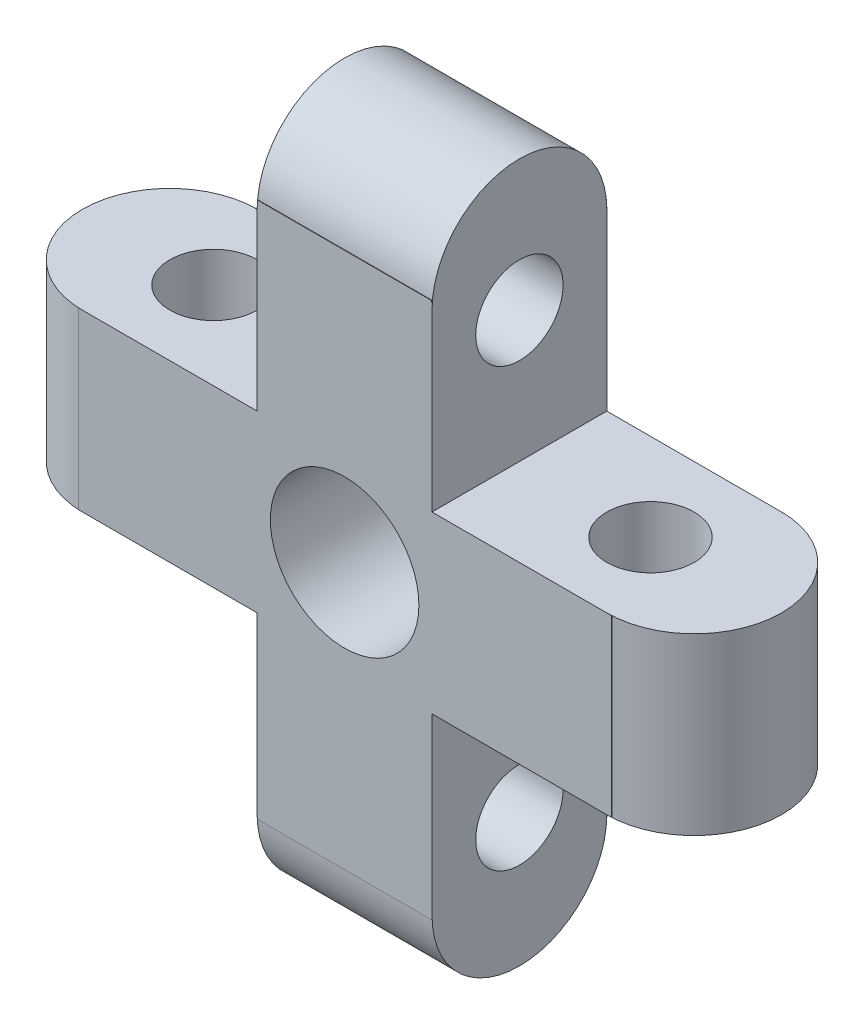
ISO-10303-21;
HEADER;
FILE_DESCRIPTION(('STEP AP214'),'2;1');
FILE_NAME('part.step','',(''),(''),'','','');
FILE_SCHEMA(('AUTOMOTIVE_DESIGN { 1 0 10303 214 1 1 1 1 }'));
ENDSEC;
DATA;
#1=APPLICATION_CONTEXT('core data for automotive mechanical design processes');
#2=APPLICATION_PROTOCOL_DEFINITION('international standard','automotive_design',2000,#1);
#3=PRODUCT_CONTEXT('',#1,'mechanical');
#4=PRODUCT('Part','Part','',(#3));
#5=PRODUCT_RELATED_PRODUCT_CATEGORY('part','',(#4));
#6=PRODUCT_DEFINITION_FORMATION('','',#4);
#7=PRODUCT_DEFINITION_CONTEXT('part definition',#1,'design');
#8=PRODUCT_DEFINITION('design','',#6,#7);
#9=PRODUCT_DEFINITION_SHAPE('','',#8);
#10=(LENGTH_UNIT() NAMED_UNIT(*) SI_UNIT(.MILLI.,.METRE.));
#11=(NAMED_UNIT(*) PLANE_ANGLE_UNIT() SI_UNIT($,.RADIAN.));
#12=(NAMED_UNIT(*) SI_UNIT($,.STERADIAN.) SOLID_ANGLE_UNIT());
#13=UNCERTAINTY_MEASURE_WITH_UNIT(LENGTH_MEASURE(1.E-05),#10,'distance_accuracy_value','');
#14=(GEOMETRIC_REPRESENTATION_CONTEXT(3) GLOBAL_UNCERTAINTY_ASSIGNED_CONTEXT((#13)) GLOBAL_UNIT_ASSIGNED_CONTEXT((#10,
#11,#12)) REPRESENTATION_CONTEXT('',''));
#15=CARTESIAN_POINT('',(0.,0.,0.));
#16=DIRECTION('',(0.,0.,1.));
#17=DIRECTION('',(1.,0.,0.));
#18=AXIS2_PLACEMENT_3D('',#15,#16,#17);
#19=CARTESIAN_POINT('',(-8.7625723784117,4.48157955571514,10.));
#20=DIRECTION('',(0.,0.,-1.));
#21=DIRECTION('',(-1.,0.,0.));
#22=AXIS2_PLACEMENT_3D('',#19,#20,#21);
#23=CYLINDRICAL_SURFACE('',#22,5.);
#24=CARTESIAN_POINT('',(-8.7625723784117,4.48157955571514,0.));
#25=DIRECTION('',(0.,0.,1.));
#26=DIRECTION('',(1.,0.,0.));
#27=AXIS2_PLACEMENT_3D('',#24,#25,#26);
#28=CIRCLE('',#27,5.);
#29=CARTESIAN_POINT('',(-8.99629887345554,-0.512954649344879,0.));
#30=VERTEX_POINT('',#29);
#31=CARTESIAN_POINT('',(-8.7625723784117,-0.51842044428487,0.));
#32=VERTEX_POINT('',#31);
#33=EDGE_CURVE('E323',#30,#32,#28,.T.);
#34=ORIENTED_EDGE('',*,*,#33,.T.);
#35=CARTESIAN_POINT('',(-8.7625723784117,4.48157955571514,5.));
#36=DIRECTION('',(0.,0.707106781186547,-0.707106781186547));
#37=DIRECTION('',(0.,-0.707106781186547,-0.707106781186547));
#38=AXIS2_PLACEMENT_3D('',#35,#36,#37);
#39=ELLIPSE('',#38,7.07106781186547,5.);
#40=CARTESIAN_POINT('',(-8.99629887345554,-0.512954649344879,0.00546579493998067));
#41=VERTEX_POINT('',#40);
#42=EDGE_CURVE('E621',#32,#41,#39,.T.);
#43=ORIENTED_EDGE('',*,*,#42,.T.);
#44=DIRECTION('',(0.,0.,-1.));
#45=VECTOR('',#44,1.);
#46=CARTESIAN_POINT('',(-8.99629887345554,-0.51295464934488,10.));
#47=LINE('',#46,#45);
#48=EDGE_CURVE('E389',#41,#30,#47,.T.);
#49=ORIENTED_EDGE('',*,*,#48,.T.);
#50=EDGE_LOOP('',(#34,#43,#49));
#51=FACE_BOUND('',#50,.T.);
#52=ADVANCED_FACE('F47',(#51),#23,.T.);
#53=CARTESIAN_POINT('',(-8.7625723784117,4.48157955571514,10.));
#54=DIRECTION('',(0.,0.,1.));
#55=DIRECTION('',(1.,0.,0.));
#56=AXIS2_PLACEMENT_3D('',#53,#54,#55);
#57=CIRCLE('',#56,5.);
#58=CARTESIAN_POINT('',(-8.7625723784117,9.48157955571513,10.));
#59=VERTEX_POINT('',#58);
#60=CARTESIAN_POINT('',(-8.99629887345554,9.47611376077515,10.));
#61=VERTEX_POINT('',#60);
#62=EDGE_CURVE('E253',#59,#61,#57,.T.);
#63=ORIENTED_EDGE('',*,*,#62,.F.);
#64=CARTESIAN_POINT('',(-8.7625723784117,4.48157955571514,5.));
#65=DIRECTION('',(0.,0.707106781186547,-0.707106781186547));
#66=DIRECTION('',(0.,-0.707106781186547,-0.707106781186547));
#67=AXIS2_PLACEMENT_3D('',#64,#65,#66);
#68=ELLIPSE('',#67,7.07106781186547,5.);
#69=CARTESIAN_POINT('',(-8.99629887345554,9.47611376077515,9.99453420506002));
#70=VERTEX_POINT('',#69);
#71=EDGE_CURVE('E231',#59,#70,#68,.F.);
#72=ORIENTED_EDGE('',*,*,#71,.T.);
#73=DIRECTION('',(0.,0.,-1.));
#74=VECTOR('',#73,1.);
#75=CARTESIAN_POINT('',(-8.99629887345554,9.47611376077515,10.));
#76=LINE('',#75,#74);
#77=EDGE_CURVE('E255',#70,#61,#76,.F.);
#78=ORIENTED_EDGE('',*,*,#77,.T.);
#79=EDGE_LOOP('',(#63,#72,#78));
#80=FACE_BOUND('',#79,.T.);
#81=ADVANCED_FACE('F254',(#80),#23,.T.);
#82=CARTESIAN_POINT('',(-8.99629887345554,-15.5184204442849,10.));
#83=DIRECTION('',(1.,0.,0.));
#84=DIRECTION('',(0.,0.,-1.));
#85=AXIS2_PLACEMENT_3D('',#82,#83,#84);
#86=PLANE('',#85);
#87=ORIENTED_EDGE('',*,*,#48,.F.);
#88=DIRECTION('',(0.,1.,0.));
#89=VECTOR('',#88,1.);
#90=CARTESIAN_POINT('',(-8.99629887345554,-0.51842044428487,0.00546579493998067));
#91=LINE('',#90,#89);
#92=CARTESIAN_POINT('',(-8.99629887345554,9.47611376077515,0.00546579493998067));
#93=VERTEX_POINT('',#92);
#94=EDGE_CURVE('E11',#41,#93,#91,.T.);
#95=ORIENTED_EDGE('',*,*,#94,.T.);
#96=CARTESIAN_POINT('',(-8.99629887345554,9.47611376077515,0.));
#97=VERTEX_POINT('',#96);
#98=EDGE_CURVE('E395',#97,#93,#76,.F.);
#99=ORIENTED_EDGE('',*,*,#98,.F.);
#100=DIRECTION('',(0.,1.,0.));
#101=VECTOR('',#100,1.);
#102=CARTESIAN_POINT('',(-8.99629887345554,0.,0.));
#103=LINE('',#102,#101);
#104=EDGE_CURVE('E365',#30,#97,#103,.T.);
#105=ORIENTED_EDGE('',*,*,#104,.F.);
#106=EDGE_LOOP('',(#87,#95,#99,#105));
#107=FACE_BOUND('',#106,.T.);
#108=ADVANCED_FACE('F718',(#107),#86,.F.);
#109=CARTESIAN_POINT('',(21.2374276215883,4.48157955571513,10.));
#110=DIRECTION('',(0.,0.,-1.));
#111=DIRECTION('',(-1.,0.,0.));
#112=AXIS2_PLACEMENT_3D('',#109,#110,#111);
#113=CYLINDRICAL_SURFACE('',#112,5.);
#114=CARTESIAN_POINT('',(21.2374276215883,4.48157955571513,5.));
#115=DIRECTION('',(0.,0.707106781186547,-0.707106781186547));
#116=DIRECTION('',(0.,-0.707106781186547,-0.707106781186547));
#117=AXIS2_PLACEMENT_3D('',#114,#115,#116);
#118=ELLIPSE('',#117,7.07106781186547,5.);
#119=CARTESIAN_POINT('',(21.2374276215883,9.48157955571513,10.));
#120=VERTEX_POINT('',#119);
#121=CARTESIAN_POINT('',(21.518100893708,9.47369559145765,9.99211603574252));
#122=VERTEX_POINT('',#121);
#123=EDGE_CURVE('E603',#120,#122,#118,.T.);
#124=ORIENTED_EDGE('',*,*,#123,.F.);
#125=CARTESIAN_POINT('',(21.2374276215883,4.48157955571513,10.));
#126=DIRECTION('',(0.,0.,1.));
#127=DIRECTION('',(1.,0.,0.));
#128=AXIS2_PLACEMENT_3D('',#125,#126,#127);
#129=CIRCLE('',#128,5.);
#130=CARTESIAN_POINT('',(21.518100893708,9.47369559145765,10.));
#131=VERTEX_POINT('',#130);
#132=EDGE_CURVE('E534',#120,#131,#129,.F.);
#133=ORIENTED_EDGE('',*,*,#132,.T.);
#134=DIRECTION('',(0.,0.,-1.));
#135=VECTOR('',#134,1.);
#136=CARTESIAN_POINT('',(21.518100893708,9.47369559145765,10.));
#137=LINE('',#136,#135);
#138=EDGE_CURVE('E401',#122,#131,#137,.F.);
#139=ORIENTED_EDGE('',*,*,#138,.F.);
#140=EDGE_LOOP('',(#124,#133,#139));
#141=FACE_BOUND('',#140,.T.);
#142=ADVANCED_FACE('F602',(#141),#113,.T.);
#143=CARTESIAN_POINT('',(21.2374276215883,4.48157955571513,5.));
#144=DIRECTION('',(0.,0.707106781186547,-0.707106781186547));
#145=DIRECTION('',(0.,-0.707106781186547,-0.707106781186547));
#146=AXIS2_PLACEMENT_3D('',#143,#144,#145);
#147=ELLIPSE('',#146,7.07106781186547,5.);
#148=CARTESIAN_POINT('',(21.2374276215883,-0.51842044428487,0.));
#149=VERTEX_POINT('',#148);
#150=CARTESIAN_POINT('',(21.518100893708,-0.510536480027385,0.00788396425747788));
#151=VERTEX_POINT('',#150);
#152=EDGE_CURVE('E71',#149,#151,#147,.F.);
#153=ORIENTED_EDGE('',*,*,#152,.F.);
#154=CARTESIAN_POINT('',(21.2374276215883,4.48157955571513,0.));
#155=DIRECTION('',(0.,0.,1.));
#156=DIRECTION('',(1.,0.,0.));
#157=AXIS2_PLACEMENT_3D('',#154,#155,#156);
#158=CIRCLE('',#157,5.);
#159=CARTESIAN_POINT('',(21.518100893708,-0.510536480027385,0.));
#160=VERTEX_POINT('',#159);
#161=EDGE_CURVE('E299',#160,#149,#158,.F.);
#162=ORIENTED_EDGE('',*,*,#161,.F.);
#163=DIRECTION('',(0.,0.,-1.));
#164=VECTOR('',#163,1.);
#165=CARTESIAN_POINT('',(21.518100893708,-0.510536480027385,10.));
#166=LINE('',#165,#164);
#167=EDGE_CURVE('E388',#151,#160,#166,.T.);
#168=ORIENTED_EDGE('',*,*,#167,.F.);
#169=EDGE_LOOP('',(#153,#162,#168));
#170=FACE_BOUND('',#169,.T.);
#171=ADVANCED_FACE('F676',(#170),#113,.T.);
#172=CARTESIAN_POINT('',(21.518100893708,-15.5184204442849,10.));
#173=DIRECTION('',(-1.,0.,0.));
#174=DIRECTION('',(0.,0.,1.));
#175=AXIS2_PLACEMENT_3D('',#172,#173,#174);
#176=PLANE('',#175);
#177=CARTESIAN_POINT('',(21.518100893708,-0.510536480027385,10.));
#178=VERTEX_POINT('',#177);
#179=CARTESIAN_POINT('',(21.518100893708,-0.510536480027385,9.99211603574252));
#180=VERTEX_POINT('',#179);
#181=EDGE_CURVE('E393',#178,#180,#166,.T.);
#182=ORIENTED_EDGE('',*,*,#181,.T.);
#183=DIRECTION('',(0.,1.,0.));
#184=VECTOR('',#183,1.);
#185=CARTESIAN_POINT('',(21.518100893708,-0.51842044428487,9.99211603574252));
#186=LINE('',#185,#184);
#187=EDGE_CURVE('E376',#180,#122,#186,.T.);
#188=ORIENTED_EDGE('',*,*,#187,.T.);
#189=ORIENTED_EDGE('',*,*,#138,.T.);
#190=DIRECTION('',(0.,1.,0.));
#191=VECTOR('',#190,1.);
#192=CARTESIAN_POINT('',(21.518100893708,-15.5184204442849,10.));
#193=LINE('',#192,#191);
#194=EDGE_CURVE('E593',#178,#131,#193,.T.);
#195=ORIENTED_EDGE('',*,*,#194,.F.);
#196=EDGE_LOOP('',(#182,#188,#189,#195));
#197=FACE_BOUND('',#196,.T.);
#198=ADVANCED_FACE('F592',(#197),#176,.F.);
#199=CARTESIAN_POINT('',(21.2374276215883,4.48157955571513,5.));
#200=DIRECTION('',(0.,-0.707106781186547,-0.707106781186547));
#201=DIRECTION('',(0.,0.707106781186547,-0.707106781186547));
#202=AXIS2_PLACEMENT_3D('',#199,#200,#201);
#203=ELLIPSE('',#202,7.07106781186547,5.);
#204=CARTESIAN_POINT('',(21.518100893708,9.47369559145765,0.00788396425747788));
#205=VERTEX_POINT('',#204);
#206=CARTESIAN_POINT('',(21.2374276215883,9.48157955571513,0.));
#207=VERTEX_POINT('',#206);
#208=EDGE_CURVE('E609',#205,#207,#203,.F.);
#209=ORIENTED_EDGE('',*,*,#208,.F.);
#210=CARTESIAN_POINT('',(21.518100893708,9.47369559145765,0.));
#211=VERTEX_POINT('',#210);
#212=EDGE_CURVE('E402',#211,#205,#137,.F.);
#213=ORIENTED_EDGE('',*,*,#212,.F.);
#214=EDGE_CURVE('E300',#207,#211,#158,.F.);
#215=ORIENTED_EDGE('',*,*,#214,.F.);
#216=EDGE_LOOP('',(#209,#213,#215));
#217=FACE_BOUND('',#216,.T.);
#218=ADVANCED_FACE('F684',(#217),#113,.T.);
#219=CARTESIAN_POINT('',(-8.99629887345554,-0.512954649344879,10.));
#220=VERTEX_POINT('',#219);
#221=CARTESIAN_POINT('',(-8.99629887345554,-0.51295464934488,9.99453420506002));
#222=VERTEX_POINT('',#221);
#223=EDGE_CURVE('E383',#220,#222,#47,.T.);
#224=ORIENTED_EDGE('',*,*,#223,.T.);
#225=CARTESIAN_POINT('',(-8.7625723784117,4.48157955571514,5.));
#226=DIRECTION('',(0.,-0.707106781186547,-0.707106781186547));
#227=DIRECTION('',(0.,0.707106781186547,-0.707106781186547));
#228=AXIS2_PLACEMENT_3D('',#225,#226,#227);
#229=ELLIPSE('',#228,7.07106781186547,5.);
#230=CARTESIAN_POINT('',(-8.7625723784117,-0.51842044428487,10.));
#231=VERTEX_POINT('',#230);
#232=EDGE_CURVE('E63',#222,#231,#229,.F.);
#233=ORIENTED_EDGE('',*,*,#232,.T.);
#234=EDGE_CURVE('E261',#220,#231,#57,.T.);
#235=ORIENTED_EDGE('',*,*,#234,.F.);
#236=EDGE_LOOP('',(#224,#233,#235));
#237=FACE_BOUND('',#236,.T.);
#238=ADVANCED_FACE('F386',(#237),#23,.T.);
#239=CARTESIAN_POINT('',(6.2374276215883,-10.5184204442849,10.));
#240=DIRECTION('',(0.,0.,-1.));
#241=DIRECTION('',(-1.,0.,0.));
#242=AXIS2_PLACEMENT_3D('',#239,#240,#241);
#243=CYLINDRICAL_SURFACE('',#242,5.);
#244=CARTESIAN_POINT('',(6.2374276215883,-10.5184204442849,10.));
#245=DIRECTION('',(0.,0.,1.));
#246=DIRECTION('',(1.,0.,0.));
#247=AXIS2_PLACEMENT_3D('',#244,#245,#246);
#248=CIRCLE('',#247,5.);
#249=CARTESIAN_POINT('',(1.2374276215883,-10.5184204442849,10.));
#250=VERTEX_POINT('',#249);
#251=CARTESIAN_POINT('',(1.2421947403534,-10.736705721456,10.));
#252=VERTEX_POINT('',#251);
#253=EDGE_CURVE('E522',#250,#252,#248,.T.);
#254=ORIENTED_EDGE('',*,*,#253,.F.);
#255=CARTESIAN_POINT('',(6.2374276215883,-10.5184204442849,5.));
#256=DIRECTION('',(-0.707106781186547,0.,-0.707106781186547));
#257=DIRECTION('',(0.707106781186547,0.,-0.707106781186547));
#258=AXIS2_PLACEMENT_3D('',#255,#256,#257);
#259=ELLIPSE('',#258,7.07106781186548,5.);
#260=CARTESIAN_POINT('',(1.2421947403534,-10.736705721456,9.9952328812349));
#261=VERTEX_POINT('',#260);
#262=EDGE_CURVE('E417',#250,#261,#259,.F.);
#263=ORIENTED_EDGE('',*,*,#262,.T.);
#264=DIRECTION('',(0.,0.,-1.));
#265=VECTOR('',#264,1.);
#266=CARTESIAN_POINT('',(1.2421947403534,-10.736705721456,10.));
#267=LINE('',#266,#265);
#268=EDGE_CURVE('E433',#261,#252,#267,.F.);
#269=ORIENTED_EDGE('',*,*,#268,.T.);
#270=EDGE_LOOP('',(#254,#263,#269));
#271=FACE_BOUND('',#270,.T.);
#272=ADVANCED_FACE('F653',(#271),#243,.T.);
#273=CARTESIAN_POINT('',(6.2374276215883,-10.5184204442849,0.));
#274=DIRECTION('',(0.,0.,1.));
#275=DIRECTION('',(1.,0.,0.));
#276=AXIS2_PLACEMENT_3D('',#273,#274,#275);
#277=CIRCLE('',#276,5.);
#278=CARTESIAN_POINT('',(11.2326605028232,-10.736705721456,0.));
#279=VERTEX_POINT('',#278);
#280=CARTESIAN_POINT('',(11.2374276215883,-10.5184204442849,0.));
#281=VERTEX_POINT('',#280);
#282=EDGE_CURVE('E287',#279,#281,#277,.T.);
#283=ORIENTED_EDGE('',*,*,#282,.T.);
#284=CARTESIAN_POINT('',(6.2374276215883,-10.5184204442849,5.));
#285=DIRECTION('',(-0.707106781186547,0.,-0.707106781186547));
#286=DIRECTION('',(0.707106781186547,0.,-0.707106781186547));
#287=AXIS2_PLACEMENT_3D('',#284,#285,#286);
#288=ELLIPSE('',#287,7.07106781186548,5.);
#289=CARTESIAN_POINT('',(11.2326605028232,-10.736705721456,0.00476711876510119));
#290=VERTEX_POINT('',#289);
#291=EDGE_CURVE('E421',#281,#290,#288,.T.);
#292=ORIENTED_EDGE('',*,*,#291,.T.);
#293=DIRECTION('',(0.,0.,-1.));
#294=VECTOR('',#293,1.);
#295=CARTESIAN_POINT('',(11.2326605028232,-10.736705721456,10.));
#296=LINE('',#295,#294);
#297=EDGE_CURVE('E438',#290,#279,#296,.T.);
#298=ORIENTED_EDGE('',*,*,#297,.T.);
#299=EDGE_LOOP('',(#283,#292,#298));
#300=FACE_BOUND('',#299,.T.);
#301=ADVANCED_FACE('F737',(#300),#243,.T.);
#302=CARTESIAN_POINT('',(26.2374276215883,-10.736705721456,0.));
#303=DIRECTION('',(0.,1.,0.));
#304=DIRECTION('',(0.,0.,1.));
#305=AXIS2_PLACEMENT_3D('',#302,#303,#304);
#306=PLANE('',#305);
#307=ORIENTED_EDGE('',*,*,#297,.F.);
#308=DIRECTION('',(-1.,0.,0.));
#309=VECTOR('',#308,1.);
#310=CARTESIAN_POINT('',(11.2374276215883,-10.736705721456,0.00476711876510119));
#311=LINE('',#310,#309);
#312=CARTESIAN_POINT('',(1.2421947403534,-10.736705721456,0.00476711876510119));
#313=VERTEX_POINT('',#312);
#314=EDGE_CURVE('E361',#290,#313,#311,.T.);
#315=ORIENTED_EDGE('',*,*,#314,.T.);
#316=CARTESIAN_POINT('',(1.2421947403534,-10.736705721456,0.));
#317=VERTEX_POINT('',#316);
#318=EDGE_CURVE('E434',#317,#313,#267,.F.);
#319=ORIENTED_EDGE('',*,*,#318,.F.);
#320=DIRECTION('',(-1.,0.,0.));
#321=VECTOR('',#320,1.);
#322=CARTESIAN_POINT('',(0.,-10.736705721456,0.));
#323=LINE('',#322,#321);
#324=EDGE_CURVE('E353',#279,#317,#323,.T.);
#325=ORIENTED_EDGE('',*,*,#324,.F.);
#326=EDGE_LOOP('',(#307,#315,#319,#325));
#327=FACE_BOUND('',#326,.T.);
#328=ADVANCED_FACE('F767',(#327),#306,.F.);
#329=ORIENTED_EDGE('',*,*,#318,.T.);
#330=CARTESIAN_POINT('',(6.2374276215883,-10.5184204442849,5.));
#331=DIRECTION('',(0.707106781186547,0.,-0.707106781186547));
#332=DIRECTION('',(-0.707106781186547,0.,-0.707106781186547));
#333=AXIS2_PLACEMENT_3D('',#330,#331,#332);
#334=ELLIPSE('',#333,7.07106781186548,5.);
#335=CARTESIAN_POINT('',(1.2374276215883,-10.5184204442849,0.));
#336=VERTEX_POINT('',#335);
#337=EDGE_CURVE('E425',#313,#336,#334,.T.);
#338=ORIENTED_EDGE('',*,*,#337,.T.);
#339=EDGE_CURVE('E288',#336,#317,#277,.T.);
#340=ORIENTED_EDGE('',*,*,#339,.T.);
#341=EDGE_LOOP('',(#329,#338,#340));
#342=FACE_BOUND('',#341,.T.);
#343=ADVANCED_FACE('F817',(#342),#243,.T.);
#344=CARTESIAN_POINT('',(6.2374276215883,19.4815795557151,10.));
#345=DIRECTION('',(0.,0.,-1.));
#346=DIRECTION('',(-1.,0.,0.));
#347=AXIS2_PLACEMENT_3D('',#344,#345,#346);
#348=CYLINDRICAL_SURFACE('',#347,5.);
#349=CARTESIAN_POINT('',(6.2374276215883,19.4815795557151,5.));
#350=DIRECTION('',(-0.707106781186547,0.,-0.707106781186547));
#351=DIRECTION('',(0.707106781186547,0.,-0.707106781186547));
#352=AXIS2_PLACEMENT_3D('',#349,#350,#351);
#353=ELLIPSE('',#352,7.07106781186548,5.);
#354=CARTESIAN_POINT('',(1.2374276215883,19.4815795557151,10.));
#355=VERTEX_POINT('',#354);
#356=CARTESIAN_POINT('',(1.25915440715939,19.9471929173143,9.97827321442891));
#357=VERTEX_POINT('',#356);
#358=EDGE_CURVE('E459',#355,#357,#353,.T.);
#359=ORIENTED_EDGE('',*,*,#358,.F.);
#360=CARTESIAN_POINT('',(6.2374276215883,19.4815795557151,10.));
#361=DIRECTION('',(0.,0.,1.));
#362=DIRECTION('',(1.,0.,0.));
#363=AXIS2_PLACEMENT_3D('',#360,#361,#362);
#364=CIRCLE('',#363,5.);
#365=CARTESIAN_POINT('',(1.25915440715939,19.9471929173143,10.));
#366=VERTEX_POINT('',#365);
#367=EDGE_CURVE('E274',#355,#366,#364,.F.);
#368=ORIENTED_EDGE('',*,*,#367,.T.);
#369=DIRECTION('',(0.,0.,-1.));
#370=VECTOR('',#369,1.);
#371=CARTESIAN_POINT('',(1.25915440715939,19.9471929173143,10.));
#372=LINE('',#371,#370);
#373=EDGE_CURVE('E471',#357,#366,#372,.F.);
#374=ORIENTED_EDGE('',*,*,#373,.F.);
#375=EDGE_LOOP('',(#359,#368,#374));
#376=FACE_BOUND('',#375,.T.);
#377=ADVANCED_FACE('F813',(#376),#348,.T.);
#378=CARTESIAN_POINT('',(6.2374276215883,19.4815795557151,5.));
#379=DIRECTION('',(-0.707106781186547,0.,-0.707106781186547));
#380=DIRECTION('',(0.707106781186547,0.,-0.707106781186547));
#381=AXIS2_PLACEMENT_3D('',#378,#379,#380);
#382=ELLIPSE('',#381,7.07106781186548,5.);
#383=CARTESIAN_POINT('',(11.2374276215883,19.4815795557151,0.));
#384=VERTEX_POINT('',#383);
#385=CARTESIAN_POINT('',(11.2157008360172,19.9471929173143,0.0217267855710922));
#386=VERTEX_POINT('',#385);
#387=EDGE_CURVE('E447',#384,#386,#382,.F.);
#388=ORIENTED_EDGE('',*,*,#387,.F.);
#389=CARTESIAN_POINT('',(6.2374276215883,19.4815795557151,0.));
#390=DIRECTION('',(0.,0.,1.));
#391=DIRECTION('',(1.,0.,0.));
#392=AXIS2_PLACEMENT_3D('',#389,#390,#391);
#393=CIRCLE('',#392,5.);
#394=CARTESIAN_POINT('',(11.2157008360172,19.9471929173143,0.));
#395=VERTEX_POINT('',#394);
#396=EDGE_CURVE('E312',#395,#384,#393,.F.);
#397=ORIENTED_EDGE('',*,*,#396,.F.);
#398=DIRECTION('',(0.,0.,-1.));
#399=VECTOR('',#398,1.);
#400=CARTESIAN_POINT('',(11.2157008360172,19.9471929173143,10.));
#401=LINE('',#400,#399);
#402=EDGE_CURVE('E466',#386,#395,#401,.T.);
#403=ORIENTED_EDGE('',*,*,#402,.F.);
#404=EDGE_LOOP('',(#388,#397,#403));
#405=FACE_BOUND('',#404,.T.);
#406=ADVANCED_FACE('F573',(#405),#348,.T.);
#407=CARTESIAN_POINT('',(26.2374276215883,19.9471929173143,10.));
#408=DIRECTION('',(0.,-1.,0.));
#409=DIRECTION('',(0.,0.,-1.));
#410=AXIS2_PLACEMENT_3D('',#407,#408,#409);
#411=PLANE('',#410);
#412=CARTESIAN_POINT('',(11.2157008360172,19.9471929173143,10.));
#413=VERTEX_POINT('',#412);
#414=CARTESIAN_POINT('',(11.2157008360172,19.9471929173143,9.97827321442891));
#415=VERTEX_POINT('',#414);
#416=EDGE_CURVE('E467',#413,#415,#401,.T.);
#417=ORIENTED_EDGE('',*,*,#416,.T.);
#418=DIRECTION('',(-1.,0.,0.));
#419=VECTOR('',#418,1.);
#420=CARTESIAN_POINT('',(11.2374276215883,19.9471929173143,9.97827321442891));
#421=LINE('',#420,#419);
#422=EDGE_CURVE('E349',#415,#357,#421,.T.);
#423=ORIENTED_EDGE('',*,*,#422,.T.);
#424=ORIENTED_EDGE('',*,*,#373,.T.);
#425=DIRECTION('',(-1.,0.,0.));
#426=VECTOR('',#425,1.);
#427=CARTESIAN_POINT('',(26.2374276215883,19.9471929173143,10.));
#428=LINE('',#427,#426);
#429=EDGE_CURVE('E462',#413,#366,#428,.T.);
#430=ORIENTED_EDGE('',*,*,#429,.F.);
#431=EDGE_LOOP('',(#417,#423,#424,#430));
#432=FACE_BOUND('',#431,.T.);
#433=ADVANCED_FACE('F775',(#432),#411,.F.);
#434=CARTESIAN_POINT('',(6.2374276215883,19.4815795557151,5.));
#435=DIRECTION('',(0.707106781186547,0.,-0.707106781186547));
#436=DIRECTION('',(-0.707106781186547,0.,-0.707106781186547));
#437=AXIS2_PLACEMENT_3D('',#434,#435,#436);
#438=ELLIPSE('',#437,7.07106781186548,5.);
#439=CARTESIAN_POINT('',(1.25915440715939,19.9471929173143,0.0217267855710914));
#440=VERTEX_POINT('',#439);
#441=CARTESIAN_POINT('',(1.2374276215883,19.4815795557151,0.));
#442=VERTEX_POINT('',#441);
#443=EDGE_CURVE('E453',#440,#442,#438,.F.);
#444=ORIENTED_EDGE('',*,*,#443,.F.);
#445=CARTESIAN_POINT('',(1.25915440715939,19.9471929173143,0.));
#446=VERTEX_POINT('',#445);
#447=EDGE_CURVE('E472',#446,#440,#372,.F.);
#448=ORIENTED_EDGE('',*,*,#447,.F.);
#449=EDGE_CURVE('E313',#442,#446,#393,.F.);
#450=ORIENTED_EDGE('',*,*,#449,.F.);
#451=EDGE_LOOP('',(#444,#448,#450));
#452=FACE_BOUND('',#451,.T.);
#453=ADVANCED_FACE('F795',(#452),#348,.T.);
#454=CARTESIAN_POINT('',(0.,-0.518420444284861,10.));
#455=DIRECTION('',(0.,1.,0.));
#456=DIRECTION('',(0.,0.,1.));
#457=AXIS2_PLACEMENT_3D('',#454,#455,#456);
#458=PLANE('',#457);
#459=CARTESIAN_POINT('',(-6.2625723784117,-0.518420444284861,5.));
#460=DIRECTION('',(0.,-1.,0.));
#461=DIRECTION('',(0.,0.,-1.));
#462=AXIS2_PLACEMENT_3D('',#459,#460,#461);
#463=CIRCLE('',#462,2.5);
#464=CARTESIAN_POINT('',(-6.2625723784117,-0.518420444284861,2.5));
#465=VERTEX_POINT('',#464);
#466=EDGE_CURVE('E505',#465,#465,#463,.T.);
#467=ORIENTED_EDGE('',*,*,#466,.F.);
#468=EDGE_LOOP('',(#467));
#469=FACE_BOUND('',#468,.T.);
#470=DIRECTION('',(1.,0.,0.));
#471=VECTOR('',#470,1.);
#472=CARTESIAN_POINT('',(0.,-0.518420444284861,10.));
#473=LINE('',#472,#471);
#474=CARTESIAN_POINT('',(1.2374276215883,-0.518420444284861,10.));
#475=VERTEX_POINT('',#474);
#476=EDGE_CURVE('E328',#231,#475,#473,.T.);
#477=ORIENTED_EDGE('',*,*,#476,.F.);
#478=CARTESIAN_POINT('',(-8.7625723784117,-0.51842044428487,5.));
#479=DIRECTION('',(0.,1.,0.));
#480=DIRECTION('',(0.,0.,-1.));
#481=AXIS2_PLACEMENT_3D('',#478,#479,#480);
#482=CIRCLE('',#481,5.);
#483=EDGE_CURVE('E250',#32,#231,#482,.T.);
#484=ORIENTED_EDGE('',*,*,#483,.F.);
#485=DIRECTION('',(1.,0.,0.));
#486=VECTOR('',#485,1.);
#487=CARTESIAN_POINT('',(0.,-0.518420444284861,0.));
#488=LINE('',#487,#486);
#489=CARTESIAN_POINT('',(1.2374276215883,-0.518420444284861,0.));
#490=VERTEX_POINT('',#489);
#491=EDGE_CURVE('E278',#32,#490,#488,.T.);
#492=ORIENTED_EDGE('',*,*,#491,.T.);
#493=DIRECTION('',(0.,0.,-1.));
#494=VECTOR('',#493,1.);
#495=CARTESIAN_POINT('',(1.2374276215883,-0.518420444284861,10.));
#496=LINE('',#495,#494);
#497=EDGE_CURVE('E338',#475,#490,#496,.T.);
#498=ORIENTED_EDGE('',*,*,#497,.F.);
#499=EDGE_LOOP('',(#477,#484,#492,#498));
#500=FACE_BOUND('',#499,.T.);
#501=ADVANCED_FACE('F49',(#469,#500),#458,.F.);
#502=CARTESIAN_POINT('',(1.2374276215883,0.,10.));
#503=DIRECTION('',(-1.,0.,0.));
#504=DIRECTION('',(0.,0.,1.));
#505=AXIS2_PLACEMENT_3D('',#502,#503,#504);
#506=PLANE('',#505);
#507=CARTESIAN_POINT('',(1.2374276215883,-8.01842044428486,5.));
#508=DIRECTION('',(1.,0.,0.));
#509=DIRECTION('',(0.,0.,-1.));
#510=AXIS2_PLACEMENT_3D('',#507,#508,#509);
#511=CIRCLE('',#510,2.5);
#512=CARTESIAN_POINT('',(1.2374276215883,-8.01842044428486,2.5));
#513=VERTEX_POINT('',#512);
#514=EDGE_CURVE('E501',#513,#513,#511,.T.);
#515=ORIENTED_EDGE('',*,*,#514,.T.);
#516=EDGE_LOOP('',(#515));
#517=FACE_BOUND('',#516,.T.);
#518=DIRECTION('',(0.,1.,0.));
#519=VECTOR('',#518,1.);
#520=CARTESIAN_POINT('',(1.2374276215883,0.,0.));
#521=LINE('',#520,#519);
#522=EDGE_CURVE('E282',#336,#490,#521,.T.);
#523=ORIENTED_EDGE('',*,*,#522,.F.);
#524=CARTESIAN_POINT('',(1.2374276215883,-10.5184204442849,5.));
#525=DIRECTION('',(-1.,0.,0.));
#526=DIRECTION('',(0.,0.,1.));
#527=AXIS2_PLACEMENT_3D('',#524,#525,#526);
#528=CIRCLE('',#527,5.);
#529=EDGE_CURVE('E406',#336,#250,#528,.T.);
#530=ORIENTED_EDGE('',*,*,#529,.T.);
#531=DIRECTION('',(0.,1.,0.));
#532=VECTOR('',#531,1.);
#533=CARTESIAN_POINT('',(1.2374276215883,0.,10.));
#534=LINE('',#533,#532);
#535=EDGE_CURVE('E517',#250,#475,#534,.T.);
#536=ORIENTED_EDGE('',*,*,#535,.T.);
#537=ORIENTED_EDGE('',*,*,#497,.T.);
#538=EDGE_LOOP('',(#523,#530,#536,#537));
#539=FACE_BOUND('',#538,.T.);
#540=ADVANCED_FACE('F646',(#517,#539),#506,.T.);
#541=CARTESIAN_POINT('',(11.2326605028232,-10.736705721456,10.));
#542=VERTEX_POINT('',#541);
#543=CARTESIAN_POINT('',(11.2326605028232,-10.736705721456,9.9952328812349));
#544=VERTEX_POINT('',#543);
#545=EDGE_CURVE('E439',#542,#544,#296,.T.);
#546=ORIENTED_EDGE('',*,*,#545,.T.);
#547=CARTESIAN_POINT('',(6.2374276215883,-10.5184204442849,5.));
#548=DIRECTION('',(0.707106781186547,0.,-0.707106781186547));
#549=DIRECTION('',(-0.707106781186547,0.,-0.707106781186547));
#550=AXIS2_PLACEMENT_3D('',#547,#548,#549);
#551=ELLIPSE('',#550,7.07106781186548,5.);
#552=CARTESIAN_POINT('',(11.2374276215883,-10.5184204442849,10.));
#553=VERTEX_POINT('',#552);
#554=EDGE_CURVE('E410',#544,#553,#551,.F.);
#555=ORIENTED_EDGE('',*,*,#554,.T.);
#556=EDGE_CURVE('E521',#542,#553,#248,.T.);
#557=ORIENTED_EDGE('',*,*,#556,.F.);
#558=EDGE_LOOP('',(#546,#555,#557));
#559=FACE_BOUND('',#558,.T.);
#560=ADVANCED_FACE('F658',(#559),#243,.T.);
#561=CARTESIAN_POINT('',(11.2374276215883,0.,10.));
#562=DIRECTION('',(-1.,0.,0.));
#563=DIRECTION('',(0.,0.,1.));
#564=AXIS2_PLACEMENT_3D('',#561,#562,#563);
#565=PLANE('',#564);
#566=CARTESIAN_POINT('',(11.2374276215883,-8.01842044428486,5.));
#567=DIRECTION('',(1.,0.,0.));
#568=DIRECTION('',(0.,0.,-1.));
#569=AXIS2_PLACEMENT_3D('',#566,#567,#568);
#570=CIRCLE('',#569,2.5);
#571=CARTESIAN_POINT('',(11.2374276215883,-8.01842044428486,2.5));
#572=VERTEX_POINT('',#571);
#573=EDGE_CURVE('E497',#572,#572,#570,.T.);
#574=ORIENTED_EDGE('',*,*,#573,.F.);
#575=EDGE_LOOP('',(#574));
#576=FACE_BOUND('',#575,.T.);
#577=DIRECTION('',(0.,1.,0.));
#578=VECTOR('',#577,1.);
#579=CARTESIAN_POINT('',(11.2374276215883,0.,10.));
#580=LINE('',#579,#578);
#581=CARTESIAN_POINT('',(11.2374276215883,-0.518420444284863,10.));
#582=VERTEX_POINT('',#581);
#583=EDGE_CURVE('E526',#553,#582,#580,.T.);
#584=ORIENTED_EDGE('',*,*,#583,.F.);
#585=CARTESIAN_POINT('',(11.2374276215883,-10.5184204442849,5.));
#586=DIRECTION('',(-1.,0.,0.));
#587=DIRECTION('',(0.,0.,1.));
#588=AXIS2_PLACEMENT_3D('',#585,#586,#587);
#589=CIRCLE('',#588,5.);
#590=EDGE_CURVE('E407',#281,#553,#589,.T.);
#591=ORIENTED_EDGE('',*,*,#590,.F.);
#592=DIRECTION('',(0.,1.,0.));
#593=VECTOR('',#592,1.);
#594=CARTESIAN_POINT('',(11.2374276215883,0.,0.));
#595=LINE('',#594,#593);
#596=CARTESIAN_POINT('',(11.2374276215883,-0.518420444284863,0.));
#597=VERTEX_POINT('',#596);
#598=EDGE_CURVE('E292',#281,#597,#595,.T.);
#599=ORIENTED_EDGE('',*,*,#598,.T.);
#600=DIRECTION('',(0.,0.,-1.));
#601=VECTOR('',#600,1.);
#602=CARTESIAN_POINT('',(11.2374276215883,-0.518420444284863,10.));
#603=LINE('',#602,#601);
#604=EDGE_CURVE('E334',#582,#597,#603,.T.);
#605=ORIENTED_EDGE('',*,*,#604,.F.);
#606=EDGE_LOOP('',(#584,#591,#599,#605));
#607=FACE_BOUND('',#606,.T.);
#608=ADVANCED_FACE('F890',(#576,#607),#565,.F.);
#609=CARTESIAN_POINT('',(0.,-0.518420444284863,10.));
#610=DIRECTION('',(0.,1.,0.));
#611=DIRECTION('',(0.,0.,1.));
#612=AXIS2_PLACEMENT_3D('',#609,#610,#611);
#613=PLANE('',#612);
#614=DIRECTION('',(1.,0.,0.));
#615=VECTOR('',#614,1.);
#616=CARTESIAN_POINT('',(0.,-0.518420444284863,0.));
#617=LINE('',#616,#615);
#618=EDGE_CURVE('E295',#597,#149,#617,.T.);
#619=ORIENTED_EDGE('',*,*,#618,.T.);
#620=CARTESIAN_POINT('',(21.2374276215883,-0.51842044428487,5.));
#621=DIRECTION('',(0.,1.,0.));
#622=DIRECTION('',(0.,0.,1.));
#623=AXIS2_PLACEMENT_3D('',#620,#621,#622);
#624=CIRCLE('',#623,5.);
#625=CARTESIAN_POINT('',(21.2374276215883,-0.51842044428487,10.));
#626=VERTEX_POINT('',#625);
#627=EDGE_CURVE('E616',#626,#149,#624,.T.);
#628=ORIENTED_EDGE('',*,*,#627,.F.);
#629=DIRECTION('',(1.,0.,0.));
#630=VECTOR('',#629,1.);
#631=CARTESIAN_POINT('',(0.,-0.518420444284863,10.));
#632=LINE('',#631,#630);
#633=EDGE_CURVE('E529',#582,#626,#632,.T.);
#634=ORIENTED_EDGE('',*,*,#633,.F.);
#635=ORIENTED_EDGE('',*,*,#604,.T.);
#636=EDGE_LOOP('',(#619,#628,#634,#635));
#637=FACE_BOUND('',#636,.T.);
#638=CARTESIAN_POINT('',(18.7374276215883,-0.51842044428487,5.));
#639=DIRECTION('',(0.,1.,0.));
#640=DIRECTION('',(0.,0.,1.));
#641=AXIS2_PLACEMENT_3D('',#638,#639,#640);
#642=CIRCLE('',#641,2.5);
#643=CARTESIAN_POINT('',(18.7374276215883,-0.51842044428487,7.5));
#644=VERTEX_POINT('',#643);
#645=EDGE_CURVE('E493',#644,#644,#642,.T.);
#646=ORIENTED_EDGE('',*,*,#645,.T.);
#647=EDGE_LOOP('',(#646));
#648=FACE_BOUND('',#647,.T.);
#649=ADVANCED_FACE('F669',(#637,#648),#613,.F.);
#650=CARTESIAN_POINT('',(21.2374276215883,4.48157955571513,5.));
#651=DIRECTION('',(0.,-0.707106781186547,-0.707106781186547));
#652=DIRECTION('',(0.,0.707106781186547,-0.707106781186547));
#653=AXIS2_PLACEMENT_3D('',#650,#651,#652);
#654=ELLIPSE('',#653,7.07106781186547,5.);
#655=EDGE_CURVE('E605',#180,#626,#654,.T.);
#656=ORIENTED_EDGE('',*,*,#655,.F.);
#657=ORIENTED_EDGE('',*,*,#181,.F.);
#658=EDGE_CURVE('E533',#178,#626,#129,.F.);
#659=ORIENTED_EDGE('',*,*,#658,.T.);
#660=EDGE_LOOP('',(#656,#657,#659));
#661=FACE_BOUND('',#660,.T.);
#662=ADVANCED_FACE('F664',(#661),#113,.T.);
#663=CARTESIAN_POINT('',(0.,9.48157955571513,10.));
#664=DIRECTION('',(0.,1.,0.));
#665=DIRECTION('',(0.,0.,1.));
#666=AXIS2_PLACEMENT_3D('',#663,#664,#665);
#667=PLANE('',#666);
#668=CARTESIAN_POINT('',(21.2374276215883,9.48157955571513,5.));
#669=DIRECTION('',(0.,1.,0.));
#670=DIRECTION('',(0.,0.,1.));
#671=AXIS2_PLACEMENT_3D('',#668,#669,#670);
#672=CIRCLE('',#671,5.);
#673=EDGE_CURVE('E617',#120,#207,#672,.T.);
#674=ORIENTED_EDGE('',*,*,#673,.T.);
#675=DIRECTION('',(1.,0.,0.));
#676=VECTOR('',#675,1.);
#677=CARTESIAN_POINT('',(0.,9.48157955571513,0.));
#678=LINE('',#677,#676);
#679=CARTESIAN_POINT('',(11.2374276215883,9.48157955571513,0.));
#680=VERTEX_POINT('',#679);
#681=EDGE_CURVE('E304',#680,#207,#678,.T.);
#682=ORIENTED_EDGE('',*,*,#681,.F.);
#683=DIRECTION('',(0.,0.,-1.));
#684=VECTOR('',#683,1.);
#685=CARTESIAN_POINT('',(11.2374276215883,9.48157955571513,10.));
#686=LINE('',#685,#684);
#687=CARTESIAN_POINT('',(11.2374276215883,9.48157955571513,10.));
#688=VERTEX_POINT('',#687);
#689=EDGE_CURVE('E331',#688,#680,#686,.T.);
#690=ORIENTED_EDGE('',*,*,#689,.F.);
#691=DIRECTION('',(1.,0.,0.));
#692=VECTOR('',#691,1.);
#693=CARTESIAN_POINT('',(0.,9.48157955571513,10.));
#694=LINE('',#693,#692);
#695=EDGE_CURVE('E538',#688,#120,#694,.T.);
#696=ORIENTED_EDGE('',*,*,#695,.T.);
#697=EDGE_LOOP('',(#674,#682,#690,#696));
#698=FACE_BOUND('',#697,.T.);
#699=CARTESIAN_POINT('',(18.7374276215883,9.48157955571513,5.));
#700=DIRECTION('',(0.,1.,0.));
#701=DIRECTION('',(0.,0.,1.));
#702=AXIS2_PLACEMENT_3D('',#699,#700,#701);
#703=CIRCLE('',#702,2.5);
#704=CARTESIAN_POINT('',(18.7374276215883,9.48157955571513,7.5));
#705=VERTEX_POINT('',#704);
#706=EDGE_CURVE('E489',#705,#705,#703,.T.);
#707=ORIENTED_EDGE('',*,*,#706,.F.);
#708=EDGE_LOOP('',(#707));
#709=FACE_BOUND('',#708,.T.);
#710=ADVANCED_FACE('F686',(#698,#709),#667,.T.);
#711=CARTESIAN_POINT('',(11.2374276215883,0.,10.));
#712=DIRECTION('',(-1.,0.,0.));
#713=DIRECTION('',(0.,0.,1.));
#714=AXIS2_PLACEMENT_3D('',#711,#712,#713);
#715=PLANE('',#714);
#716=DIRECTION('',(0.,1.,0.));
#717=VECTOR('',#716,1.);
#718=CARTESIAN_POINT('',(11.2374276215883,0.,0.));
#719=LINE('',#718,#717);
#720=EDGE_CURVE('E308',#680,#384,#719,.T.);
#721=ORIENTED_EDGE('',*,*,#720,.T.);
#722=CARTESIAN_POINT('',(11.2374276215883,19.4815795557151,5.));
#723=DIRECTION('',(-1.,0.,0.));
#724=DIRECTION('',(0.,0.,-1.));
#725=AXIS2_PLACEMENT_3D('',#722,#723,#724);
#726=CIRCLE('',#725,5.);
#727=CARTESIAN_POINT('',(11.2374276215883,19.4815795557151,10.));
#728=VERTEX_POINT('',#727);
#729=EDGE_CURVE('E444',#728,#384,#726,.T.);
#730=ORIENTED_EDGE('',*,*,#729,.F.);
#731=DIRECTION('',(0.,1.,0.));
#732=VECTOR('',#731,1.);
#733=CARTESIAN_POINT('',(11.2374276215883,0.,10.));
#734=LINE('',#733,#732);
#735=EDGE_CURVE('E542',#688,#728,#734,.T.);
#736=ORIENTED_EDGE('',*,*,#735,.F.);
#737=ORIENTED_EDGE('',*,*,#689,.T.);
#738=EDGE_LOOP('',(#721,#730,#736,#737));
#739=FACE_BOUND('',#738,.T.);
#740=CARTESIAN_POINT('',(11.2374276215883,16.9815795557151,5.));
#741=DIRECTION('',(-1.,0.,0.));
#742=DIRECTION('',(0.,0.,1.));
#743=AXIS2_PLACEMENT_3D('',#740,#741,#742);
#744=CIRCLE('',#743,2.5);
#745=CARTESIAN_POINT('',(11.2374276215883,16.9815795557151,7.5));
#746=VERTEX_POINT('',#745);
#747=EDGE_CURVE('E485',#746,#746,#744,.T.);
#748=ORIENTED_EDGE('',*,*,#747,.T.);
#749=EDGE_LOOP('',(#748));
#750=FACE_BOUND('',#749,.T.);
#751=ADVANCED_FACE('F563',(#739,#750),#715,.F.);
#752=CARTESIAN_POINT('',(6.2374276215883,19.4815795557151,5.));
#753=DIRECTION('',(0.707106781186547,0.,-0.707106781186547));
#754=DIRECTION('',(-0.707106781186547,0.,-0.707106781186547));
#755=AXIS2_PLACEMENT_3D('',#752,#753,#754);
#756=ELLIPSE('',#755,7.07106781186548,5.);
#757=EDGE_CURVE('E456',#415,#728,#756,.T.);
#758=ORIENTED_EDGE('',*,*,#757,.F.);
#759=ORIENTED_EDGE('',*,*,#416,.F.);
#760=EDGE_CURVE('E545',#413,#728,#364,.F.);
#761=ORIENTED_EDGE('',*,*,#760,.T.);
#762=EDGE_LOOP('',(#758,#759,#761));
#763=FACE_BOUND('',#762,.T.);
#764=ADVANCED_FACE('F557',(#763),#348,.T.);
#765=CARTESIAN_POINT('',(1.2374276215883,0.,10.));
#766=DIRECTION('',(-1.,0.,0.));
#767=DIRECTION('',(0.,0.,1.));
#768=AXIS2_PLACEMENT_3D('',#765,#766,#767);
#769=PLANE('',#768);
#770=CARTESIAN_POINT('',(1.2374276215883,19.4815795557151,5.));
#771=DIRECTION('',(-1.,0.,0.));
#772=DIRECTION('',(0.,0.,-1.));
#773=AXIS2_PLACEMENT_3D('',#770,#771,#772);
#774=CIRCLE('',#773,5.);
#775=EDGE_CURVE('E443',#355,#442,#774,.T.);
#776=ORIENTED_EDGE('',*,*,#775,.T.);
#777=DIRECTION('',(0.,1.,0.));
#778=VECTOR('',#777,1.);
#779=CARTESIAN_POINT('',(1.2374276215883,0.,0.));
#780=LINE('',#779,#778);
#781=CARTESIAN_POINT('',(1.2374276215883,9.48157955571513,0.));
#782=VERTEX_POINT('',#781);
#783=EDGE_CURVE('E317',#782,#442,#780,.T.);
#784=ORIENTED_EDGE('',*,*,#783,.F.);
#785=DIRECTION('',(0.,0.,-1.));
#786=VECTOR('',#785,1.);
#787=CARTESIAN_POINT('',(1.2374276215883,9.48157955571513,10.));
#788=LINE('',#787,#786);
#789=CARTESIAN_POINT('',(1.2374276215883,9.48157955571513,10.));
#790=VERTEX_POINT('',#789);
#791=EDGE_CURVE('E260',#790,#782,#788,.T.);
#792=ORIENTED_EDGE('',*,*,#791,.F.);
#793=DIRECTION('',(0.,1.,0.));
#794=VECTOR('',#793,1.);
#795=CARTESIAN_POINT('',(1.2374276215883,0.,10.));
#796=LINE('',#795,#794);
#797=EDGE_CURVE('E268',#790,#355,#796,.T.);
#798=ORIENTED_EDGE('',*,*,#797,.T.);
#799=EDGE_LOOP('',(#776,#784,#792,#798));
#800=FACE_BOUND('',#799,.T.);
#801=CARTESIAN_POINT('',(1.2374276215883,16.9815795557151,5.));
#802=DIRECTION('',(-1.,0.,0.));
#803=DIRECTION('',(0.,0.,1.));
#804=AXIS2_PLACEMENT_3D('',#801,#802,#803);
#805=CIRCLE('',#804,2.5);
#806=CARTESIAN_POINT('',(1.2374276215883,16.9815795557151,7.5));
#807=VERTEX_POINT('',#806);
#808=EDGE_CURVE('E481',#807,#807,#805,.T.);
#809=ORIENTED_EDGE('',*,*,#808,.F.);
#810=EDGE_LOOP('',(#809));
#811=FACE_BOUND('',#810,.T.);
#812=ADVANCED_FACE('F728',(#800,#811),#769,.T.);
#813=CARTESIAN_POINT('',(0.,9.48157955571513,10.));
#814=DIRECTION('',(0.,1.,0.));
#815=DIRECTION('',(-1.,0.,0.));
#816=AXIS2_PLACEMENT_3D('',#813,#814,#815);
#817=PLANE('',#816);
#818=CARTESIAN_POINT('',(-6.2625723784117,9.48157955571514,5.));
#819=DIRECTION('',(0.,-1.,0.));
#820=DIRECTION('',(0.,0.,-1.));
#821=AXIS2_PLACEMENT_3D('',#818,#819,#820);
#822=CIRCLE('',#821,2.5);
#823=CARTESIAN_POINT('',(-6.2625723784117,9.48157955571514,2.5));
#824=VERTEX_POINT('',#823);
#825=EDGE_CURVE('E283',#824,#824,#822,.T.);
#826=ORIENTED_EDGE('',*,*,#825,.T.);
#827=EDGE_LOOP('',(#826));
#828=FACE_BOUND('',#827,.T.);
#829=DIRECTION('',(1.,0.,0.));
#830=VECTOR('',#829,1.);
#831=CARTESIAN_POINT('',(0.,9.48157955571513,0.));
#832=LINE('',#831,#830);
#833=CARTESIAN_POINT('',(-8.7625723784117,9.48157955571513,0.));
#834=VERTEX_POINT('',#833);
#835=EDGE_CURVE('E248',#834,#782,#832,.T.);
#836=ORIENTED_EDGE('',*,*,#835,.F.);
#837=CARTESIAN_POINT('',(-8.7625723784117,9.48157955571513,5.));
#838=DIRECTION('',(0.,1.,0.));
#839=DIRECTION('',(0.,0.,-1.));
#840=AXIS2_PLACEMENT_3D('',#837,#838,#839);
#841=CIRCLE('',#840,5.);
#842=EDGE_CURVE('E234',#834,#59,#841,.T.);
#843=ORIENTED_EDGE('',*,*,#842,.T.);
#844=DIRECTION('',(1.,0.,0.));
#845=VECTOR('',#844,1.);
#846=CARTESIAN_POINT('',(0.,9.48157955571513,10.));
#847=LINE('',#846,#845);
#848=EDGE_CURVE('E246',#59,#790,#847,.T.);
#849=ORIENTED_EDGE('',*,*,#848,.T.);
#850=ORIENTED_EDGE('',*,*,#791,.T.);
#851=EDGE_LOOP('',(#836,#843,#849,#850));
#852=FACE_BOUND('',#851,.T.);
#853=ADVANCED_FACE('F244',(#828,#852),#817,.T.);
#854=ORIENTED_EDGE('',*,*,#98,.T.);
#855=CARTESIAN_POINT('',(-8.7625723784117,4.48157955571514,5.));
#856=DIRECTION('',(0.,-0.707106781186547,-0.707106781186547));
#857=DIRECTION('',(0.,0.707106781186547,-0.707106781186547));
#858=AXIS2_PLACEMENT_3D('',#855,#856,#857);
#859=ELLIPSE('',#858,7.07106781186547,5.);
#860=EDGE_CURVE('E627',#93,#834,#859,.T.);
#861=ORIENTED_EDGE('',*,*,#860,.T.);
#862=EDGE_CURVE('E324',#834,#97,#28,.T.);
#863=ORIENTED_EDGE('',*,*,#862,.T.);
#864=EDGE_LOOP('',(#854,#861,#863));
#865=FACE_BOUND('',#864,.T.);
#866=ADVANCED_FACE('F713',(#865),#23,.T.);
#867=CARTESIAN_POINT('',(0.,0.,10.));
#868=DIRECTION('',(0.,0.,1.));
#869=DIRECTION('',(1.,0.,0.));
#870=AXIS2_PLACEMENT_3D('',#867,#868,#869);
#871=PLANE('',#870);
#872=ORIENTED_EDGE('',*,*,#848,.F.);
#873=ORIENTED_EDGE('',*,*,#62,.T.);
#874=DIRECTION('',(0.,1.,0.));
#875=VECTOR('',#874,1.);
#876=CARTESIAN_POINT('',(-8.99629887345554,-15.5184204442849,10.));
#877=LINE('',#876,#875);
#878=EDGE_CURVE('E600',#220,#61,#877,.T.);
#879=ORIENTED_EDGE('',*,*,#878,.F.);
#880=ORIENTED_EDGE('',*,*,#234,.T.);
#881=ORIENTED_EDGE('',*,*,#476,.T.);
#882=ORIENTED_EDGE('',*,*,#535,.F.);
#883=ORIENTED_EDGE('',*,*,#253,.T.);
#884=DIRECTION('',(-1.,0.,0.));
#885=VECTOR('',#884,1.);
#886=CARTESIAN_POINT('',(26.2374276215883,-10.736705721456,10.));
#887=LINE('',#886,#885);
#888=EDGE_CURVE('E429',#542,#252,#887,.T.);
#889=ORIENTED_EDGE('',*,*,#888,.F.);
#890=ORIENTED_EDGE('',*,*,#556,.T.);
#891=ORIENTED_EDGE('',*,*,#583,.T.);
#892=ORIENTED_EDGE('',*,*,#633,.T.);
#893=ORIENTED_EDGE('',*,*,#658,.F.);
#894=ORIENTED_EDGE('',*,*,#194,.T.);
#895=ORIENTED_EDGE('',*,*,#132,.F.);
#896=ORIENTED_EDGE('',*,*,#695,.F.);
#897=ORIENTED_EDGE('',*,*,#735,.T.);
#898=ORIENTED_EDGE('',*,*,#760,.F.);
#899=ORIENTED_EDGE('',*,*,#429,.T.);
#900=ORIENTED_EDGE('',*,*,#367,.F.);
#901=ORIENTED_EDGE('',*,*,#797,.F.);
#902=EDGE_LOOP('',(#872,#873,#879,#880,#881,#882,#883,#889,#890,#891,#892,#893,#894,#895,#896,
#897,#898,#899,#900,#901));
#903=FACE_BOUND('',#902,.T.);
#904=CARTESIAN_POINT('',(6.2374276215883,4.48157955571513,10.));
#905=DIRECTION('',(0.,0.,1.));
#906=DIRECTION('',(1.,0.,0.));
#907=AXIS2_PLACEMENT_3D('',#904,#905,#906);
#908=CIRCLE('',#907,4.25);
#909=CARTESIAN_POINT('',(10.4874276215883,4.48157955571513,10.));
#910=VERTEX_POINT('',#909);
#911=EDGE_CURVE('E476',#910,#910,#908,.T.);
#912=ORIENTED_EDGE('',*,*,#911,.F.);
#913=EDGE_LOOP('',(#912));
#914=FACE_BOUND('',#913,.T.);
#915=ADVANCED_FACE('F264',(#903,#914),#871,.T.);
#916=CARTESIAN_POINT('',(0.,0.,0.));
#917=DIRECTION('',(0.,0.,1.));
#918=DIRECTION('',(1.,0.,0.));
#919=AXIS2_PLACEMENT_3D('',#916,#917,#918);
#920=PLANE('',#919);
#921=ORIENTED_EDGE('',*,*,#491,.F.);
#922=ORIENTED_EDGE('',*,*,#33,.F.);
#923=ORIENTED_EDGE('',*,*,#104,.T.);
#924=ORIENTED_EDGE('',*,*,#862,.F.);
#925=ORIENTED_EDGE('',*,*,#835,.T.);
#926=ORIENTED_EDGE('',*,*,#783,.T.);
#927=ORIENTED_EDGE('',*,*,#449,.T.);
#928=DIRECTION('',(1.,0.,0.));
#929=VECTOR('',#928,1.);
#930=CARTESIAN_POINT('',(0.,19.9471929173143,0.));
#931=LINE('',#930,#929);
#932=EDGE_CURVE('E341',#446,#395,#931,.T.);
#933=ORIENTED_EDGE('',*,*,#932,.T.);
#934=ORIENTED_EDGE('',*,*,#396,.T.);
#935=ORIENTED_EDGE('',*,*,#720,.F.);
#936=ORIENTED_EDGE('',*,*,#681,.T.);
#937=ORIENTED_EDGE('',*,*,#214,.T.);
#938=DIRECTION('',(0.,-1.,0.));
#939=VECTOR('',#938,1.);
#940=CARTESIAN_POINT('',(21.518100893708,0.,0.));
#941=LINE('',#940,#939);
#942=EDGE_CURVE('E369',#211,#160,#941,.T.);
#943=ORIENTED_EDGE('',*,*,#942,.T.);
#944=ORIENTED_EDGE('',*,*,#161,.T.);
#945=ORIENTED_EDGE('',*,*,#618,.F.);
#946=ORIENTED_EDGE('',*,*,#598,.F.);
#947=ORIENTED_EDGE('',*,*,#282,.F.);
#948=ORIENTED_EDGE('',*,*,#324,.T.);
#949=ORIENTED_EDGE('',*,*,#339,.F.);
#950=ORIENTED_EDGE('',*,*,#522,.T.);
#951=EDGE_LOOP('',(#921,#922,#923,#924,#925,#926,#927,#933,#934,#935,#936,#937,#943,#944,#945,
#946,#947,#948,#949,#950));
#952=FACE_BOUND('',#951,.T.);
#953=CARTESIAN_POINT('',(6.2374276215883,4.48157955571513,0.));
#954=DIRECTION('',(0.,0.,1.));
#955=DIRECTION('',(1.,0.,0.));
#956=AXIS2_PLACEMENT_3D('',#953,#954,#955);
#957=CIRCLE('',#956,4.25);
#958=CARTESIAN_POINT('',(10.4874276215883,4.48157955571513,0.));
#959=VERTEX_POINT('',#958);
#960=EDGE_CURVE('E477',#959,#959,#957,.T.);
#961=ORIENTED_EDGE('',*,*,#960,.T.);
#962=EDGE_LOOP('',(#961));
#963=FACE_BOUND('',#962,.T.);
#964=ADVANCED_FACE('F576',(#952,#963),#920,.F.);
#965=CARTESIAN_POINT('',(-6.2625723784117,9.48157955571514,5.));
#966=DIRECTION('',(0.,-1.,0.));
#967=DIRECTION('',(0.,0.,-1.));
#968=AXIS2_PLACEMENT_3D('',#965,#966,#967);
#969=CYLINDRICAL_SURFACE('',#968,2.5);
#970=ORIENTED_EDGE('',*,*,#825,.F.);
#971=EDGE_LOOP('',(#970));
#972=FACE_BOUND('',#971,.T.);
#973=ORIENTED_EDGE('',*,*,#466,.T.);
#974=EDGE_LOOP('',(#973));
#975=FACE_BOUND('',#974,.T.);
#976=ADVANCED_FACE('F707',(#972,#975),#969,.F.);
#977=CARTESIAN_POINT('',(1.2374276215883,-8.01842044428486,5.));
#978=DIRECTION('',(1.,0.,0.));
#979=DIRECTION('',(0.,0.,-1.));
#980=AXIS2_PLACEMENT_3D('',#977,#978,#979);
#981=CYLINDRICAL_SURFACE('',#980,2.5);
#982=ORIENTED_EDGE('',*,*,#514,.F.);
#983=EDGE_LOOP('',(#982));
#984=FACE_BOUND('',#983,.T.);
#985=ORIENTED_EDGE('',*,*,#573,.T.);
#986=EDGE_LOOP('',(#985));
#987=FACE_BOUND('',#986,.T.);
#988=ADVANCED_FACE('F695',(#984,#987),#981,.F.);
#989=CARTESIAN_POINT('',(18.7374276215883,-0.51842044428487,5.));
#990=DIRECTION('',(0.,1.,0.));
#991=DIRECTION('',(0.,0.,1.));
#992=AXIS2_PLACEMENT_3D('',#989,#990,#991);
#993=CYLINDRICAL_SURFACE('',#992,2.5);
#994=ORIENTED_EDGE('',*,*,#645,.F.);
#995=EDGE_LOOP('',(#994));
#996=FACE_BOUND('',#995,.T.);
#997=ORIENTED_EDGE('',*,*,#706,.T.);
#998=EDGE_LOOP('',(#997));
#999=FACE_BOUND('',#998,.T.);
#1000=ADVANCED_FACE('F692',(#996,#999),#993,.F.);
#1001=CARTESIAN_POINT('',(11.2374276215883,16.9815795557151,5.));
#1002=DIRECTION('',(-1.,0.,0.));
#1003=DIRECTION('',(0.,0.,1.));
#1004=AXIS2_PLACEMENT_3D('',#1001,#1002,#1003);
#1005=CYLINDRICAL_SURFACE('',#1004,2.5);
#1006=ORIENTED_EDGE('',*,*,#747,.F.);
#1007=EDGE_LOOP('',(#1006));
#1008=FACE_BOUND('',#1007,.T.);
#1009=ORIENTED_EDGE('',*,*,#808,.T.);
#1010=EDGE_LOOP('',(#1009));
#1011=FACE_BOUND('',#1010,.T.);
#1012=ADVANCED_FACE('F694',(#1008,#1011),#1005,.F.);
#1013=CARTESIAN_POINT('',(6.2374276215883,4.48157955571513,0.));
#1014=DIRECTION('',(0.,0.,1.));
#1015=DIRECTION('',(1.,0.,0.));
#1016=AXIS2_PLACEMENT_3D('',#1013,#1014,#1015);
#1017=CYLINDRICAL_SURFACE('',#1016,4.25);
#1018=ORIENTED_EDGE('',*,*,#960,.F.);
#1019=EDGE_LOOP('',(#1018));
#1020=FACE_BOUND('',#1019,.T.);
#1021=ORIENTED_EDGE('',*,*,#911,.T.);
#1022=EDGE_LOOP('',(#1021));
#1023=FACE_BOUND('',#1022,.T.);
#1024=ADVANCED_FACE('F703',(#1020,#1023),#1017,.F.);
#1025=ORIENTED_EDGE('',*,*,#447,.T.);
#1026=DIRECTION('',(-1.,0.,0.));
#1027=VECTOR('',#1026,1.);
#1028=CARTESIAN_POINT('',(11.2374276215883,19.9471929173143,0.0217267855710914));
#1029=LINE('',#1028,#1027);
#1030=EDGE_CURVE('E345',#440,#386,#1029,.F.);
#1031=ORIENTED_EDGE('',*,*,#1030,.T.);
#1032=ORIENTED_EDGE('',*,*,#402,.T.);
#1033=ORIENTED_EDGE('',*,*,#932,.F.);
#1034=EDGE_LOOP('',(#1025,#1031,#1032,#1033));
#1035=FACE_BOUND('',#1034,.T.);
#1036=ADVANCED_FACE('F771',(#1035),#411,.F.);
#1037=CARTESIAN_POINT('',(11.2374276215883,19.4815795557151,5.));
#1038=DIRECTION('',(-1.,0.,0.));
#1039=DIRECTION('',(0.,0.,1.));
#1040=AXIS2_PLACEMENT_3D('',#1037,#1038,#1039);
#1041=CYLINDRICAL_SURFACE('',#1040,5.);
#1042=ORIENTED_EDGE('',*,*,#775,.F.);
#1043=ORIENTED_EDGE('',*,*,#358,.T.);
#1044=ORIENTED_EDGE('',*,*,#422,.F.);
#1045=ORIENTED_EDGE('',*,*,#757,.T.);
#1046=ORIENTED_EDGE('',*,*,#729,.T.);
#1047=ORIENTED_EDGE('',*,*,#387,.T.);
#1048=ORIENTED_EDGE('',*,*,#1030,.F.);
#1049=ORIENTED_EDGE('',*,*,#443,.T.);
#1050=EDGE_LOOP('',(#1042,#1043,#1044,#1045,#1046,#1047,#1048,#1049));
#1051=FACE_BOUND('',#1050,.T.);
#1052=ADVANCED_FACE('F568',(#1051),#1041,.T.);
#1053=ORIENTED_EDGE('',*,*,#268,.F.);
#1054=DIRECTION('',(-1.,0.,0.));
#1055=VECTOR('',#1054,1.);
#1056=CARTESIAN_POINT('',(11.2374276215883,-10.736705721456,9.9952328812349));
#1057=LINE('',#1056,#1055);
#1058=EDGE_CURVE('E357',#261,#544,#1057,.F.);
#1059=ORIENTED_EDGE('',*,*,#1058,.T.);
#1060=ORIENTED_EDGE('',*,*,#545,.F.);
#1061=ORIENTED_EDGE('',*,*,#888,.T.);
#1062=EDGE_LOOP('',(#1053,#1059,#1060,#1061));
#1063=FACE_BOUND('',#1062,.T.);
#1064=ADVANCED_FACE('F656',(#1063),#306,.F.);
#1065=CARTESIAN_POINT('',(11.2374276215883,-10.5184204442849,5.));
#1066=DIRECTION('',(-1.,0.,0.));
#1067=DIRECTION('',(0.,0.,1.));
#1068=AXIS2_PLACEMENT_3D('',#1065,#1066,#1067);
#1069=CYLINDRICAL_SURFACE('',#1068,5.);
#1070=ORIENTED_EDGE('',*,*,#337,.F.);
#1071=ORIENTED_EDGE('',*,*,#314,.F.);
#1072=ORIENTED_EDGE('',*,*,#291,.F.);
#1073=ORIENTED_EDGE('',*,*,#590,.T.);
#1074=ORIENTED_EDGE('',*,*,#554,.F.);
#1075=ORIENTED_EDGE('',*,*,#1058,.F.);
#1076=ORIENTED_EDGE('',*,*,#262,.F.);
#1077=ORIENTED_EDGE('',*,*,#529,.F.);
#1078=EDGE_LOOP('',(#1070,#1071,#1072,#1073,#1074,#1075,#1076,#1077));
#1079=FACE_BOUND('',#1078,.T.);
#1080=ADVANCED_FACE('F758',(#1079),#1069,.T.);
#1081=ORIENTED_EDGE('',*,*,#77,.F.);
#1082=DIRECTION('',(0.,1.,0.));
#1083=VECTOR('',#1082,1.);
#1084=CARTESIAN_POINT('',(-8.99629887345554,-0.51842044428487,9.99453420506002));
#1085=LINE('',#1084,#1083);
#1086=EDGE_CURVE('E56',#70,#222,#1085,.F.);
#1087=ORIENTED_EDGE('',*,*,#1086,.T.);
#1088=ORIENTED_EDGE('',*,*,#223,.F.);
#1089=ORIENTED_EDGE('',*,*,#878,.T.);
#1090=EDGE_LOOP('',(#1081,#1087,#1088,#1089));
#1091=FACE_BOUND('',#1090,.T.);
#1092=ADVANCED_FACE('F382',(#1091),#86,.F.);
#1093=ORIENTED_EDGE('',*,*,#212,.T.);
#1094=DIRECTION('',(0.,1.,0.));
#1095=VECTOR('',#1094,1.);
#1096=CARTESIAN_POINT('',(21.518100893708,-0.51842044428487,0.00788396425747788));
#1097=LINE('',#1096,#1095);
#1098=EDGE_CURVE('E373',#205,#151,#1097,.F.);
#1099=ORIENTED_EDGE('',*,*,#1098,.T.);
#1100=ORIENTED_EDGE('',*,*,#167,.T.);
#1101=ORIENTED_EDGE('',*,*,#942,.F.);
#1102=EDGE_LOOP('',(#1093,#1099,#1100,#1101));
#1103=FACE_BOUND('',#1102,.T.);
#1104=ADVANCED_FACE('F681',(#1103),#176,.F.);
#1105=CARTESIAN_POINT('',(21.2374276215883,-0.51842044428487,5.));
#1106=DIRECTION('',(0.,1.,0.));
#1107=DIRECTION('',(0.,0.,1.));
#1108=AXIS2_PLACEMENT_3D('',#1105,#1106,#1107);
#1109=CYLINDRICAL_SURFACE('',#1108,5.);
#1110=ORIENTED_EDGE('',*,*,#673,.F.);
#1111=ORIENTED_EDGE('',*,*,#123,.T.);
#1112=ORIENTED_EDGE('',*,*,#187,.F.);
#1113=ORIENTED_EDGE('',*,*,#655,.T.);
#1114=ORIENTED_EDGE('',*,*,#627,.T.);
#1115=ORIENTED_EDGE('',*,*,#152,.T.);
#1116=ORIENTED_EDGE('',*,*,#1098,.F.);
#1117=ORIENTED_EDGE('',*,*,#208,.T.);
#1118=EDGE_LOOP('',(#1110,#1111,#1112,#1113,#1114,#1115,#1116,#1117));
#1119=FACE_BOUND('',#1118,.T.);
#1120=ADVANCED_FACE('F672',(#1119),#1109,.T.);
#1121=CARTESIAN_POINT('',(-8.7625723784117,-0.51842044428487,5.));
#1122=DIRECTION('',(0.,1.,0.));
#1123=DIRECTION('',(0.,0.,1.));
#1124=AXIS2_PLACEMENT_3D('',#1121,#1122,#1123);
#1125=CYLINDRICAL_SURFACE('',#1124,5.);
#1126=ORIENTED_EDGE('',*,*,#42,.F.);
#1127=ORIENTED_EDGE('',*,*,#483,.T.);
#1128=ORIENTED_EDGE('',*,*,#232,.F.);
#1129=ORIENTED_EDGE('',*,*,#1086,.F.);
#1130=ORIENTED_EDGE('',*,*,#71,.F.);
#1131=ORIENTED_EDGE('',*,*,#842,.F.);
#1132=ORIENTED_EDGE('',*,*,#860,.F.);
#1133=ORIENTED_EDGE('',*,*,#94,.F.);
#1134=EDGE_LOOP('',(#1126,#1127,#1128,#1129,#1130,#1131,#1132,#1133));
#1135=FACE_BOUND('',#1134,.T.);
#1136=ADVANCED_FACE('F233',(#1135),#1125,.T.);
#1137=CLOSED_SHELL('',(#52,#81,#108,#142,#171,#198,#218,#238,#272,#301,#328,#343,#377,#406,#433,
#453,#501,#540,#560,#608,#649,#662,#710,#751,#764,#812,#853,#866,#915,#964,#976,#988,#1000,
#1012,#1024,#1036,#1052,#1064,#1080,#1092,#1104,#1120,#1136));
#1138=MANIFOLD_SOLID_BREP('B2',#1137);
#1139=ADVANCED_BREP_SHAPE_REPRESENTATION('',(#18,#1138),#14);
#1140=SHAPE_DEFINITION_REPRESENTATION(#9,#1139);
ENDSEC;
END-ISO-10303-21;
